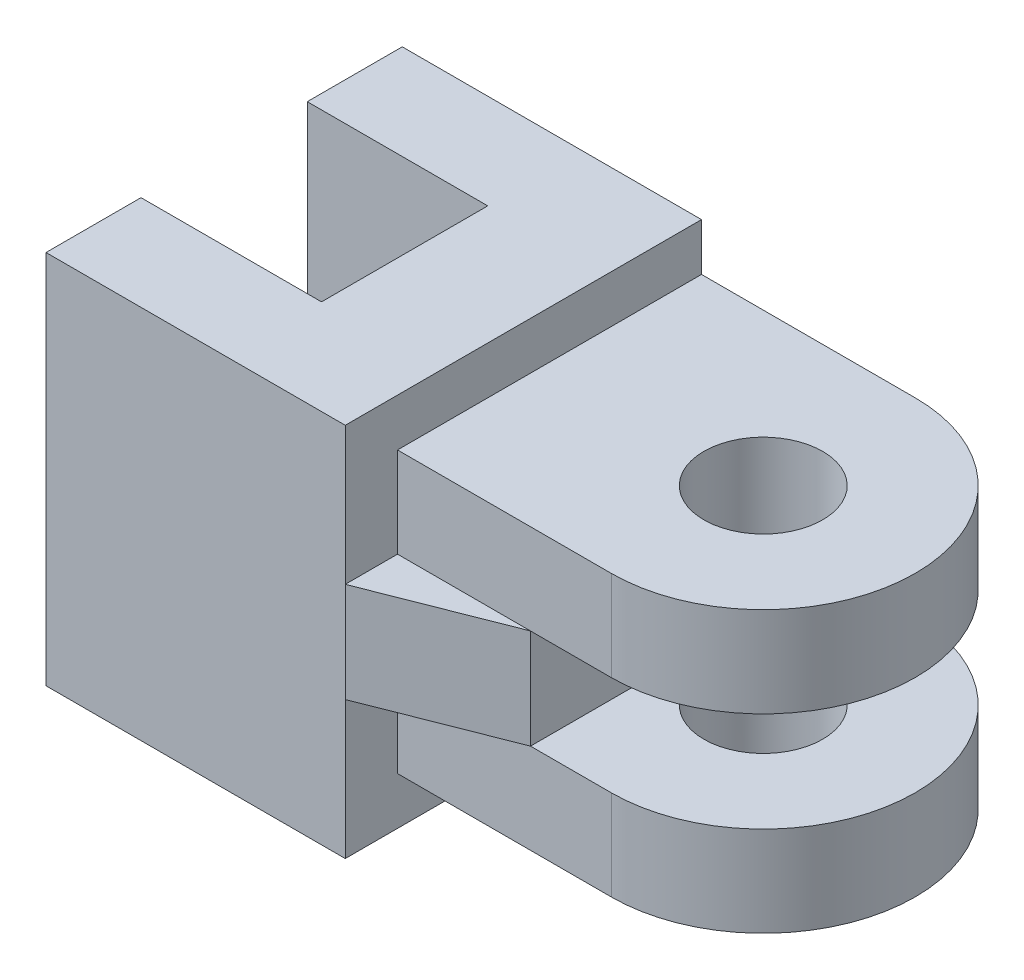
ISO-10303-21;
HEADER;
FILE_DESCRIPTION(('STEP AP214'),'2;1');
FILE_NAME('part.step','',(''),(''),'','','');
FILE_SCHEMA(('AUTOMOTIVE_DESIGN { 1 0 10303 214 1 1 1 1 }'));
ENDSEC;
DATA;
#1=APPLICATION_CONTEXT('core data for automotive mechanical design processes');
#2=APPLICATION_PROTOCOL_DEFINITION('international standard','automotive_design',2000,#1);
#3=PRODUCT_CONTEXT('',#1,'mechanical');
#4=PRODUCT('Part','Part','',(#3));
#5=PRODUCT_RELATED_PRODUCT_CATEGORY('part','',(#4));
#6=PRODUCT_DEFINITION_FORMATION('','',#4);
#7=PRODUCT_DEFINITION_CONTEXT('part definition',#1,'design');
#8=PRODUCT_DEFINITION('design','',#6,#7);
#9=PRODUCT_DEFINITION_SHAPE('','',#8);
#10=(LENGTH_UNIT() NAMED_UNIT(*) SI_UNIT(.MILLI.,.METRE.));
#11=(NAMED_UNIT(*) PLANE_ANGLE_UNIT() SI_UNIT($,.RADIAN.));
#12=(NAMED_UNIT(*) SI_UNIT($,.STERADIAN.) SOLID_ANGLE_UNIT());
#13=UNCERTAINTY_MEASURE_WITH_UNIT(LENGTH_MEASURE(1.E-05),#10,'distance_accuracy_value','');
#14=(GEOMETRIC_REPRESENTATION_CONTEXT(3) GLOBAL_UNCERTAINTY_ASSIGNED_CONTEXT((#13)) GLOBAL_UNIT_ASSIGNED_CONTEXT((#10,
#11,#12)) REPRESENTATION_CONTEXT('',''));
#15=CARTESIAN_POINT('',(0.,0.,0.));
#16=DIRECTION('',(0.,0.,1.));
#17=DIRECTION('',(1.,0.,0.));
#18=AXIS2_PLACEMENT_3D('',#15,#16,#17);
#19=CARTESIAN_POINT('',(31.5,39.5,37.5));
#20=DIRECTION('',(0.,1.,0.));
#21=DIRECTION('',(1.,0.,0.));
#22=AXIS2_PLACEMENT_3D('',#19,#20,#21);
#23=PLANE('',#22);
#24=DIRECTION('',(-1.,0.,0.));
#25=VECTOR('',#24,1.);
#26=CARTESIAN_POINT('',(15.75,39.5,55.));
#27=LINE('',#26,#25);
#28=CARTESIAN_POINT('',(38.,39.5,55.));
#29=VERTEX_POINT('',#28);
#30=CARTESIAN_POINT('',(0.,39.5,55.));
#31=VERTEX_POINT('',#30);
#32=EDGE_CURVE('E244',#29,#31,#27,.T.);
#33=ORIENTED_EDGE('',*,*,#32,.T.);
#34=DIRECTION('',(0.,0.,1.));
#35=VECTOR('',#34,1.);
#36=CARTESIAN_POINT('',(0.,39.5,0.));
#37=LINE('',#36,#35);
#38=CARTESIAN_POINT('',(0.,39.5,75.));
#39=VERTEX_POINT('',#38);
#40=EDGE_CURVE('E342',#31,#39,#37,.T.);
#41=ORIENTED_EDGE('',*,*,#40,.T.);
#42=DIRECTION('',(1.,0.,0.));
#43=VECTOR('',#42,1.);
#44=CARTESIAN_POINT('',(0.,39.5,75.));
#45=LINE('',#44,#43);
#46=CARTESIAN_POINT('',(63.,39.5,75.));
#47=VERTEX_POINT('',#46);
#48=EDGE_CURVE('E9',#39,#47,#45,.T.);
#49=ORIENTED_EDGE('',*,*,#48,.T.);
#50=DIRECTION('',(0.,0.,-1.));
#51=VECTOR('',#50,1.);
#52=CARTESIAN_POINT('',(63.,39.5,75.));
#53=LINE('',#52,#51);
#54=CARTESIAN_POINT('',(63.,39.5,0.));
#55=VERTEX_POINT('',#54);
#56=EDGE_CURVE('E278',#47,#55,#53,.T.);
#57=ORIENTED_EDGE('',*,*,#56,.T.);
#58=DIRECTION('',(-1.,0.,0.));
#59=VECTOR('',#58,1.);
#60=CARTESIAN_POINT('',(63.,39.5,0.));
#61=LINE('',#60,#59);
#62=CARTESIAN_POINT('',(0.,39.5,0.));
#63=VERTEX_POINT('',#62);
#64=EDGE_CURVE('E232',#55,#63,#61,.T.);
#65=ORIENTED_EDGE('',*,*,#64,.T.);
#66=DIRECTION('',(0.,0.,1.));
#67=VECTOR('',#66,1.);
#68=CARTESIAN_POINT('',(0.,39.5,0.));
#69=LINE('',#68,#67);
#70=CARTESIAN_POINT('',(0.,39.5,20.));
#71=VERTEX_POINT('',#70);
#72=EDGE_CURVE('E19',#63,#71,#69,.T.);
#73=ORIENTED_EDGE('',*,*,#72,.T.);
#74=DIRECTION('',(1.,0.,0.));
#75=VECTOR('',#74,1.);
#76=CARTESIAN_POINT('',(34.75,39.5,20.));
#77=LINE('',#76,#75);
#78=CARTESIAN_POINT('',(38.,39.5,20.));
#79=VERTEX_POINT('',#78);
#80=EDGE_CURVE('E269',#71,#79,#77,.T.);
#81=ORIENTED_EDGE('',*,*,#80,.T.);
#82=DIRECTION('',(0.,0.,1.));
#83=VECTOR('',#82,1.);
#84=CARTESIAN_POINT('',(38.,39.5,46.25));
#85=LINE('',#84,#83);
#86=EDGE_CURVE('E308',#79,#29,#85,.T.);
#87=ORIENTED_EDGE('',*,*,#86,.T.);
#88=EDGE_LOOP('',(#33,#41,#49,#57,#65,#73,#81,#87));
#89=FACE_BOUND('',#88,.T.);
#90=ADVANCED_FACE('F15',(#89),#23,.T.);
#91=CARTESIAN_POINT('',(0.,0.,75.));
#92=DIRECTION('',(0.,0.,1.));
#93=DIRECTION('',(1.,0.,0.));
#94=AXIS2_PLACEMENT_3D('',#91,#92,#93);
#95=PLANE('',#94);
#96=DIRECTION('',(0.,1.,0.));
#97=VECTOR('',#96,1.);
#98=CARTESIAN_POINT('',(63.,0.,75.));
#99=LINE('',#98,#97);
#100=CARTESIAN_POINT('',(63.,-39.5,75.));
#101=VERTEX_POINT('',#100);
#102=CARTESIAN_POINT('',(63.,-10.5,75.));
#103=VERTEX_POINT('',#102);
#104=EDGE_CURVE('E321',#101,#103,#99,.T.);
#105=ORIENTED_EDGE('',*,*,#104,.T.);
#106=DIRECTION('',(0.,1.,0.));
#107=VECTOR('',#106,1.);
#108=CARTESIAN_POINT('',(63.,0.,75.));
#109=LINE('',#108,#107);
#110=CARTESIAN_POINT('',(63.,10.5,75.));
#111=VERTEX_POINT('',#110);
#112=EDGE_CURVE('E233',#103,#111,#109,.T.);
#113=ORIENTED_EDGE('',*,*,#112,.T.);
#114=DIRECTION('',(0.,1.,0.));
#115=VECTOR('',#114,1.);
#116=CARTESIAN_POINT('',(63.,0.,75.));
#117=LINE('',#116,#115);
#118=EDGE_CURVE('E275',#111,#47,#117,.T.);
#119=ORIENTED_EDGE('',*,*,#118,.T.);
#120=ORIENTED_EDGE('',*,*,#48,.F.);
#121=DIRECTION('',(0.,1.,0.));
#122=VECTOR('',#121,1.);
#123=CARTESIAN_POINT('',(0.,0.,75.));
#124=LINE('',#123,#122);
#125=CARTESIAN_POINT('',(0.,-39.5,75.));
#126=VERTEX_POINT('',#125);
#127=EDGE_CURVE('E345',#126,#39,#124,.T.);
#128=ORIENTED_EDGE('',*,*,#127,.F.);
#129=DIRECTION('',(-1.,0.,0.));
#130=VECTOR('',#129,1.);
#131=CARTESIAN_POINT('',(0.,-39.5,75.));
#132=LINE('',#131,#130);
#133=EDGE_CURVE('E26',#101,#126,#132,.T.);
#134=ORIENTED_EDGE('',*,*,#133,.F.);
#135=EDGE_LOOP('',(#105,#113,#119,#120,#128,#134));
#136=FACE_BOUND('',#135,.T.);
#137=ADVANCED_FACE('F416',(#136),#95,.T.);
#138=CARTESIAN_POINT('',(31.5,-39.5,37.5));
#139=DIRECTION('',(0.,-1.,0.));
#140=DIRECTION('',(0.,0.,-1.));
#141=AXIS2_PLACEMENT_3D('',#138,#139,#140);
#142=PLANE('',#141);
#143=DIRECTION('',(1.,0.,0.));
#144=VECTOR('',#143,1.);
#145=CARTESIAN_POINT('',(15.75,-39.5,55.));
#146=LINE('',#145,#144);
#147=CARTESIAN_POINT('',(0.,-39.5,55.));
#148=VERTEX_POINT('',#147);
#149=CARTESIAN_POINT('',(38.,-39.5,55.));
#150=VERTEX_POINT('',#149);
#151=EDGE_CURVE('E243',#148,#150,#146,.T.);
#152=ORIENTED_EDGE('',*,*,#151,.T.);
#153=DIRECTION('',(0.,0.,-1.));
#154=VECTOR('',#153,1.);
#155=CARTESIAN_POINT('',(38.,-39.5,46.25));
#156=LINE('',#155,#154);
#157=CARTESIAN_POINT('',(38.,-39.5,20.));
#158=VERTEX_POINT('',#157);
#159=EDGE_CURVE('E93',#150,#158,#156,.T.);
#160=ORIENTED_EDGE('',*,*,#159,.T.);
#161=DIRECTION('',(-1.,0.,0.));
#162=VECTOR('',#161,1.);
#163=CARTESIAN_POINT('',(34.75,-39.5,20.));
#164=LINE('',#163,#162);
#165=CARTESIAN_POINT('',(0.,-39.5,20.));
#166=VERTEX_POINT('',#165);
#167=EDGE_CURVE('E268',#158,#166,#164,.T.);
#168=ORIENTED_EDGE('',*,*,#167,.T.);
#169=DIRECTION('',(0.,0.,-1.));
#170=VECTOR('',#169,1.);
#171=CARTESIAN_POINT('',(0.,-39.5,0.));
#172=LINE('',#171,#170);
#173=CARTESIAN_POINT('',(0.,-39.5,0.));
#174=VERTEX_POINT('',#173);
#175=EDGE_CURVE('E106',#166,#174,#172,.T.);
#176=ORIENTED_EDGE('',*,*,#175,.T.);
#177=DIRECTION('',(1.,0.,0.));
#178=VECTOR('',#177,1.);
#179=CARTESIAN_POINT('',(63.,-39.5,0.));
#180=LINE('',#179,#178);
#181=CARTESIAN_POINT('',(63.,-39.5,0.));
#182=VERTEX_POINT('',#181);
#183=EDGE_CURVE('E316',#174,#182,#180,.T.);
#184=ORIENTED_EDGE('',*,*,#183,.T.);
#185=DIRECTION('',(0.,0.,1.));
#186=VECTOR('',#185,1.);
#187=CARTESIAN_POINT('',(63.,-39.5,64.));
#188=LINE('',#187,#186);
#189=EDGE_CURVE('E325',#182,#101,#188,.T.);
#190=ORIENTED_EDGE('',*,*,#189,.T.);
#191=ORIENTED_EDGE('',*,*,#133,.T.);
#192=DIRECTION('',(0.,0.,-1.));
#193=VECTOR('',#192,1.);
#194=CARTESIAN_POINT('',(0.,-39.5,0.));
#195=LINE('',#194,#193);
#196=EDGE_CURVE('E354',#126,#148,#195,.T.);
#197=ORIENTED_EDGE('',*,*,#196,.T.);
#198=EDGE_LOOP('',(#152,#160,#168,#176,#184,#190,#191,#197));
#199=FACE_BOUND('',#198,.T.);
#200=ADVANCED_FACE('F420',(#199),#142,.T.);
#201=CARTESIAN_POINT('',(0.,0.,0.));
#202=DIRECTION('',(-1.,0.,0.));
#203=DIRECTION('',(0.,1.,0.));
#204=AXIS2_PLACEMENT_3D('',#201,#202,#203);
#205=PLANE('',#204);
#206=DIRECTION('',(0.,-1.,0.));
#207=VECTOR('',#206,1.);
#208=CARTESIAN_POINT('',(0.,0.,55.));
#209=LINE('',#208,#207);
#210=EDGE_CURVE('E304',#31,#148,#209,.T.);
#211=ORIENTED_EDGE('',*,*,#210,.T.);
#212=ORIENTED_EDGE('',*,*,#196,.F.);
#213=ORIENTED_EDGE('',*,*,#127,.T.);
#214=ORIENTED_EDGE('',*,*,#40,.F.);
#215=EDGE_LOOP('',(#211,#212,#213,#214));
#216=FACE_BOUND('',#215,.T.);
#217=ADVANCED_FACE('F414',(#216),#205,.T.);
#218=CARTESIAN_POINT('',(0.,0.,0.));
#219=DIRECTION('',(-1.,0.,0.));
#220=DIRECTION('',(0.,1.,0.));
#221=AXIS2_PLACEMENT_3D('',#218,#219,#220);
#222=PLANE('',#221);
#223=DIRECTION('',(0.,1.,0.));
#224=VECTOR('',#223,1.);
#225=CARTESIAN_POINT('',(0.,0.,20.));
#226=LINE('',#225,#224);
#227=EDGE_CURVE('E265',#166,#71,#226,.T.);
#228=ORIENTED_EDGE('',*,*,#227,.T.);
#229=ORIENTED_EDGE('',*,*,#72,.F.);
#230=DIRECTION('',(0.,-1.,0.));
#231=VECTOR('',#230,1.);
#232=CARTESIAN_POINT('',(0.,0.,0.));
#233=LINE('',#232,#231);
#234=EDGE_CURVE('E300',#63,#174,#233,.T.);
#235=ORIENTED_EDGE('',*,*,#234,.T.);
#236=ORIENTED_EDGE('',*,*,#175,.F.);
#237=EDGE_LOOP('',(#228,#229,#235,#236));
#238=FACE_BOUND('',#237,.T.);
#239=ADVANCED_FACE('F470',(#238),#222,.T.);
#240=CARTESIAN_POINT('',(38.,0.,55.));
#241=DIRECTION('',(1.,0.,0.));
#242=DIRECTION('',(0.,0.,-1.));
#243=AXIS2_PLACEMENT_3D('',#240,#241,#242);
#244=PLANE('',#243);
#245=ORIENTED_EDGE('',*,*,#86,.F.);
#246=DIRECTION('',(0.,1.,0.));
#247=VECTOR('',#246,1.);
#248=CARTESIAN_POINT('',(38.,0.,20.));
#249=LINE('',#248,#247);
#250=EDGE_CURVE('E293',#158,#79,#249,.T.);
#251=ORIENTED_EDGE('',*,*,#250,.F.);
#252=ORIENTED_EDGE('',*,*,#159,.F.);
#253=DIRECTION('',(0.,1.,0.));
#254=VECTOR('',#253,1.);
#255=CARTESIAN_POINT('',(38.,0.,55.));
#256=LINE('',#255,#254);
#257=EDGE_CURVE('E239',#150,#29,#256,.T.);
#258=ORIENTED_EDGE('',*,*,#257,.T.);
#259=EDGE_LOOP('',(#245,#251,#252,#258));
#260=FACE_BOUND('',#259,.T.);
#261=ADVANCED_FACE('F464',(#260),#244,.F.);
#262=CARTESIAN_POINT('',(38.,0.,20.));
#263=DIRECTION('',(0.,0.,-1.));
#264=DIRECTION('',(-1.,0.,0.));
#265=AXIS2_PLACEMENT_3D('',#262,#263,#264);
#266=PLANE('',#265);
#267=ORIENTED_EDGE('',*,*,#80,.F.);
#268=ORIENTED_EDGE('',*,*,#227,.F.);
#269=ORIENTED_EDGE('',*,*,#167,.F.);
#270=ORIENTED_EDGE('',*,*,#250,.T.);
#271=EDGE_LOOP('',(#267,#268,#269,#270));
#272=FACE_BOUND('',#271,.T.);
#273=ADVANCED_FACE('F469',(#272),#266,.F.);
#274=CARTESIAN_POINT('',(0.,0.,55.));
#275=DIRECTION('',(0.,0.,1.));
#276=DIRECTION('',(1.,0.,0.));
#277=AXIS2_PLACEMENT_3D('',#274,#275,#276);
#278=PLANE('',#277);
#279=ORIENTED_EDGE('',*,*,#32,.F.);
#280=ORIENTED_EDGE('',*,*,#257,.F.);
#281=ORIENTED_EDGE('',*,*,#151,.F.);
#282=ORIENTED_EDGE('',*,*,#210,.F.);
#283=EDGE_LOOP('',(#279,#280,#281,#282));
#284=FACE_BOUND('',#283,.T.);
#285=ADVANCED_FACE('F532',(#284),#278,.F.);
#286=CARTESIAN_POINT('',(77.,-29.5,32.));
#287=DIRECTION('',(0.,-1.,0.));
#288=DIRECTION('',(0.,0.,-1.));
#289=AXIS2_PLACEMENT_3D('',#286,#287,#288);
#290=PLANE('',#289);
#291=CARTESIAN_POINT('',(108.,-29.5,32.));
#292=DIRECTION('',(0.,1.,0.));
#293=DIRECTION('',(1.,0.,0.));
#294=AXIS2_PLACEMENT_3D('',#291,#292,#293);
#295=CIRCLE('',#294,12.5);
#296=CARTESIAN_POINT('',(120.5,-29.5,32.));
#297=VERTEX_POINT('',#296);
#298=EDGE_CURVE('E311',#297,#297,#295,.T.);
#299=ORIENTED_EDGE('',*,*,#298,.T.);
#300=EDGE_LOOP('',(#299));
#301=FACE_BOUND('',#300,.T.);
#302=CARTESIAN_POINT('',(108.,-29.5,32.));
#303=DIRECTION('',(0.,1.,0.));
#304=DIRECTION('',(0.,0.,1.));
#305=AXIS2_PLACEMENT_3D('',#302,#303,#304);
#306=CIRCLE('',#305,32.);
#307=CARTESIAN_POINT('',(108.,-29.5,64.));
#308=VERTEX_POINT('',#307);
#309=CARTESIAN_POINT('',(108.,-29.5,0.));
#310=VERTEX_POINT('',#309);
#311=EDGE_CURVE('E290',#308,#310,#306,.T.);
#312=ORIENTED_EDGE('',*,*,#311,.F.);
#313=DIRECTION('',(-1.,0.,0.));
#314=VECTOR('',#313,1.);
#315=CARTESIAN_POINT('',(63.,-29.5,64.));
#316=LINE('',#315,#314);
#317=CARTESIAN_POINT('',(63.,-29.5,64.));
#318=VERTEX_POINT('',#317);
#319=EDGE_CURVE('E273',#308,#318,#316,.T.);
#320=ORIENTED_EDGE('',*,*,#319,.T.);
#321=DIRECTION('',(0.,0.,1.));
#322=VECTOR('',#321,1.);
#323=CARTESIAN_POINT('',(63.,-29.5,53.5));
#324=LINE('',#323,#322);
#325=CARTESIAN_POINT('',(63.,-29.5,0.));
#326=VERTEX_POINT('',#325);
#327=EDGE_CURVE('E226',#326,#318,#324,.T.);
#328=ORIENTED_EDGE('',*,*,#327,.F.);
#329=DIRECTION('',(1.,0.,0.));
#330=VECTOR('',#329,1.);
#331=CARTESIAN_POINT('',(140.,-29.5,0.));
#332=LINE('',#331,#330);
#333=EDGE_CURVE('E259',#326,#310,#332,.T.);
#334=ORIENTED_EDGE('',*,*,#333,.T.);
#335=EDGE_LOOP('',(#312,#320,#328,#334));
#336=FACE_BOUND('',#335,.T.);
#337=ADVANCED_FACE('F537',(#301,#336),#290,.T.);
#338=CARTESIAN_POINT('',(77.,29.5,32.));
#339=DIRECTION('',(0.,1.,0.));
#340=DIRECTION('',(1.,0.,0.));
#341=AXIS2_PLACEMENT_3D('',#338,#339,#340);
#342=PLANE('',#341);
#343=CARTESIAN_POINT('',(108.,29.5,32.));
#344=DIRECTION('',(0.,-1.,0.));
#345=DIRECTION('',(1.,0.,0.));
#346=AXIS2_PLACEMENT_3D('',#343,#344,#345);
#347=CIRCLE('',#346,12.5);
#348=CARTESIAN_POINT('',(95.5,29.5,32.));
#349=VERTEX_POINT('',#348);
#350=EDGE_CURVE('E254',#349,#349,#347,.T.);
#351=ORIENTED_EDGE('',*,*,#350,.T.);
#352=EDGE_LOOP('',(#351));
#353=FACE_BOUND('',#352,.T.);
#354=CARTESIAN_POINT('',(108.,29.5,32.));
#355=DIRECTION('',(0.,-1.,0.));
#356=DIRECTION('',(0.,0.,1.));
#357=AXIS2_PLACEMENT_3D('',#354,#355,#356);
#358=CIRCLE('',#357,32.);
#359=CARTESIAN_POINT('',(108.,29.5,0.));
#360=VERTEX_POINT('',#359);
#361=CARTESIAN_POINT('',(108.,29.5,64.));
#362=VERTEX_POINT('',#361);
#363=EDGE_CURVE('E285',#360,#362,#358,.T.);
#364=ORIENTED_EDGE('',*,*,#363,.F.);
#365=DIRECTION('',(-1.,0.,0.));
#366=VECTOR('',#365,1.);
#367=CARTESIAN_POINT('',(140.,29.5,0.));
#368=LINE('',#367,#366);
#369=CARTESIAN_POINT('',(63.,29.5,0.));
#370=VERTEX_POINT('',#369);
#371=EDGE_CURVE('E208',#360,#370,#368,.T.);
#372=ORIENTED_EDGE('',*,*,#371,.T.);
#373=DIRECTION('',(0.,0.,-1.));
#374=VECTOR('',#373,1.);
#375=CARTESIAN_POINT('',(63.,29.5,53.5));
#376=LINE('',#375,#374);
#377=CARTESIAN_POINT('',(63.,29.5,64.));
#378=VERTEX_POINT('',#377);
#379=EDGE_CURVE('E205',#378,#370,#376,.T.);
#380=ORIENTED_EDGE('',*,*,#379,.F.);
#381=DIRECTION('',(1.,0.,0.));
#382=VECTOR('',#381,1.);
#383=CARTESIAN_POINT('',(63.,29.5,64.));
#384=LINE('',#383,#382);
#385=EDGE_CURVE('E189',#378,#362,#384,.T.);
#386=ORIENTED_EDGE('',*,*,#385,.T.);
#387=EDGE_LOOP('',(#364,#372,#380,#386));
#388=FACE_BOUND('',#387,.T.);
#389=ADVANCED_FACE('F206',(#353,#388),#342,.T.);
#390=CARTESIAN_POINT('',(108.,0.,32.));
#391=DIRECTION('',(0.,1.,0.));
#392=DIRECTION('',(0.,0.,1.));
#393=AXIS2_PLACEMENT_3D('',#390,#391,#392);
#394=CYLINDRICAL_SURFACE('',#393,32.);
#395=CARTESIAN_POINT('',(108.,10.5,32.));
#396=DIRECTION('',(0.,1.,0.));
#397=DIRECTION('',(0.,0.,1.));
#398=AXIS2_PLACEMENT_3D('',#395,#396,#397);
#399=CIRCLE('',#398,32.);
#400=CARTESIAN_POINT('',(108.,10.5,64.));
#401=VERTEX_POINT('',#400);
#402=CARTESIAN_POINT('',(108.,10.5,0.));
#403=VERTEX_POINT('',#402);
#404=EDGE_CURVE('E202',#401,#403,#399,.T.);
#405=ORIENTED_EDGE('',*,*,#404,.T.);
#406=DIRECTION('',(0.,1.,0.));
#407=VECTOR('',#406,1.);
#408=CARTESIAN_POINT('',(108.,0.,0.));
#409=LINE('',#408,#407);
#410=EDGE_CURVE('E231',#403,#360,#409,.T.);
#411=ORIENTED_EDGE('',*,*,#410,.T.);
#412=ORIENTED_EDGE('',*,*,#363,.T.);
#413=DIRECTION('',(0.,-1.,0.));
#414=VECTOR('',#413,1.);
#415=CARTESIAN_POINT('',(108.,0.,64.));
#416=LINE('',#415,#414);
#417=EDGE_CURVE('E198',#362,#401,#416,.T.);
#418=ORIENTED_EDGE('',*,*,#417,.T.);
#419=EDGE_LOOP('',(#405,#411,#412,#418));
#420=FACE_BOUND('',#419,.T.);
#421=ADVANCED_FACE('F525',(#420),#394,.T.);
#422=CARTESIAN_POINT('',(108.,0.,32.));
#423=DIRECTION('',(0.,1.,0.));
#424=DIRECTION('',(0.,0.,1.));
#425=AXIS2_PLACEMENT_3D('',#422,#423,#424);
#426=CYLINDRICAL_SURFACE('',#425,32.);
#427=CARTESIAN_POINT('',(108.,-10.5,32.));
#428=DIRECTION('',(0.,-1.,0.));
#429=DIRECTION('',(0.,0.,1.));
#430=AXIS2_PLACEMENT_3D('',#427,#428,#429);
#431=CIRCLE('',#430,32.);
#432=CARTESIAN_POINT('',(108.,-10.5,0.));
#433=VERTEX_POINT('',#432);
#434=CARTESIAN_POINT('',(108.,-10.5,64.));
#435=VERTEX_POINT('',#434);
#436=EDGE_CURVE('E249',#433,#435,#431,.T.);
#437=ORIENTED_EDGE('',*,*,#436,.T.);
#438=DIRECTION('',(0.,-1.,0.));
#439=VECTOR('',#438,1.);
#440=CARTESIAN_POINT('',(108.,0.,64.));
#441=LINE('',#440,#439);
#442=EDGE_CURVE('E270',#435,#308,#441,.T.);
#443=ORIENTED_EDGE('',*,*,#442,.T.);
#444=ORIENTED_EDGE('',*,*,#311,.T.);
#445=DIRECTION('',(0.,1.,0.));
#446=VECTOR('',#445,1.);
#447=CARTESIAN_POINT('',(108.,0.,0.));
#448=LINE('',#447,#446);
#449=EDGE_CURVE('E256',#310,#433,#448,.T.);
#450=ORIENTED_EDGE('',*,*,#449,.T.);
#451=EDGE_LOOP('',(#437,#443,#444,#450));
#452=FACE_BOUND('',#451,.T.);
#453=ADVANCED_FACE('F520',(#452),#426,.T.);
#454=CARTESIAN_POINT('',(63.,0.,0.));
#455=DIRECTION('',(0.,0.,-1.));
#456=DIRECTION('',(0.,-1.,0.));
#457=AXIS2_PLACEMENT_3D('',#454,#455,#456);
#458=PLANE('',#457);
#459=DIRECTION('',(-1.,0.,0.));
#460=VECTOR('',#459,1.);
#461=CARTESIAN_POINT('',(89.25,10.5,0.));
#462=LINE('',#461,#460);
#463=CARTESIAN_POINT('',(91.,10.5,0.));
#464=VERTEX_POINT('',#463);
#465=EDGE_CURVE('E245',#403,#464,#462,.T.);
#466=ORIENTED_EDGE('',*,*,#465,.T.);
#467=DIRECTION('',(0.,-1.,0.));
#468=VECTOR('',#467,1.);
#469=CARTESIAN_POINT('',(91.,0.,0.));
#470=LINE('',#469,#468);
#471=CARTESIAN_POINT('',(91.,-10.5,0.));
#472=VERTEX_POINT('',#471);
#473=EDGE_CURVE('E260',#464,#472,#470,.T.);
#474=ORIENTED_EDGE('',*,*,#473,.T.);
#475=DIRECTION('',(1.,0.,0.));
#476=VECTOR('',#475,1.);
#477=CARTESIAN_POINT('',(89.25,-10.5,0.));
#478=LINE('',#477,#476);
#479=EDGE_CURVE('E315',#472,#433,#478,.T.);
#480=ORIENTED_EDGE('',*,*,#479,.T.);
#481=ORIENTED_EDGE('',*,*,#449,.F.);
#482=ORIENTED_EDGE('',*,*,#333,.F.);
#483=DIRECTION('',(0.,1.,0.));
#484=VECTOR('',#483,1.);
#485=CARTESIAN_POINT('',(63.,0.,0.));
#486=LINE('',#485,#484);
#487=EDGE_CURVE('E365',#182,#326,#486,.T.);
#488=ORIENTED_EDGE('',*,*,#487,.F.);
#489=ORIENTED_EDGE('',*,*,#183,.F.);
#490=ORIENTED_EDGE('',*,*,#234,.F.);
#491=ORIENTED_EDGE('',*,*,#64,.F.);
#492=DIRECTION('',(0.,1.,0.));
#493=VECTOR('',#492,1.);
#494=CARTESIAN_POINT('',(63.,0.,0.));
#495=LINE('',#494,#493);
#496=EDGE_CURVE('E213',#370,#55,#495,.T.);
#497=ORIENTED_EDGE('',*,*,#496,.F.);
#498=ORIENTED_EDGE('',*,*,#371,.F.);
#499=ORIENTED_EDGE('',*,*,#410,.F.);
#500=EDGE_LOOP('',(#466,#474,#480,#481,#482,#488,#489,#490,#491,#497,#498,#499));
#501=FACE_BOUND('',#500,.T.);
#502=ADVANCED_FACE('F513',(#501),#458,.T.);
#503=CARTESIAN_POINT('',(91.,0.,0.));
#504=DIRECTION('',(-1.,0.,0.));
#505=DIRECTION('',(0.,0.,1.));
#506=AXIS2_PLACEMENT_3D('',#503,#504,#505);
#507=PLANE('',#506);
#508=DIRECTION('',(0.,1.,0.));
#509=VECTOR('',#508,1.);
#510=CARTESIAN_POINT('',(91.,0.,64.));
#511=LINE('',#510,#509);
#512=CARTESIAN_POINT('',(91.,-10.5,64.));
#513=VERTEX_POINT('',#512);
#514=CARTESIAN_POINT('',(91.,10.5,64.));
#515=VERTEX_POINT('',#514);
#516=EDGE_CURVE('E341',#513,#515,#511,.T.);
#517=ORIENTED_EDGE('',*,*,#516,.F.);
#518=DIRECTION('',(0.,0.,-1.));
#519=VECTOR('',#518,1.);
#520=CARTESIAN_POINT('',(91.,-10.5,0.));
#521=LINE('',#520,#519);
#522=EDGE_CURVE('E281',#513,#472,#521,.T.);
#523=ORIENTED_EDGE('',*,*,#522,.T.);
#524=ORIENTED_EDGE('',*,*,#473,.F.);
#525=DIRECTION('',(0.,0.,1.));
#526=VECTOR('',#525,1.);
#527=CARTESIAN_POINT('',(91.,10.5,0.));
#528=LINE('',#527,#526);
#529=EDGE_CURVE('E250',#464,#515,#528,.T.);
#530=ORIENTED_EDGE('',*,*,#529,.T.);
#531=EDGE_LOOP('',(#517,#523,#524,#530));
#532=FACE_BOUND('',#531,.T.);
#533=ADVANCED_FACE('F483',(#532),#507,.F.);
#534=CARTESIAN_POINT('',(115.5,-10.5,32.));
#535=DIRECTION('',(0.,-1.,0.));
#536=DIRECTION('',(0.,0.,-1.));
#537=AXIS2_PLACEMENT_3D('',#534,#535,#536);
#538=PLANE('',#537);
#539=CARTESIAN_POINT('',(108.,-10.5,32.));
#540=DIRECTION('',(0.,-1.,0.));
#541=DIRECTION('',(1.,0.,0.));
#542=AXIS2_PLACEMENT_3D('',#539,#540,#541);
#543=CIRCLE('',#542,12.5);
#544=CARTESIAN_POINT('',(95.5,-10.5,32.));
#545=VERTEX_POINT('',#544);
#546=EDGE_CURVE('E255',#545,#545,#543,.T.);
#547=ORIENTED_EDGE('',*,*,#546,.T.);
#548=EDGE_LOOP('',(#547));
#549=FACE_BOUND('',#548,.T.);
#550=ORIENTED_EDGE('',*,*,#436,.F.);
#551=ORIENTED_EDGE('',*,*,#479,.F.);
#552=ORIENTED_EDGE('',*,*,#522,.F.);
#553=DIRECTION('',(-1.,0.,0.));
#554=VECTOR('',#553,1.);
#555=CARTESIAN_POINT('',(89.25,-10.5,64.));
#556=LINE('',#555,#554);
#557=EDGE_CURVE('E264',#435,#513,#556,.T.);
#558=ORIENTED_EDGE('',*,*,#557,.F.);
#559=EDGE_LOOP('',(#550,#551,#552,#558));
#560=FACE_BOUND('',#559,.T.);
#561=ADVANCED_FACE('F477',(#549,#560),#538,.F.);
#562=CARTESIAN_POINT('',(115.5,10.5,32.));
#563=DIRECTION('',(0.,1.,0.));
#564=DIRECTION('',(1.,0.,0.));
#565=AXIS2_PLACEMENT_3D('',#562,#563,#564);
#566=PLANE('',#565);
#567=CARTESIAN_POINT('',(108.,10.5,32.));
#568=DIRECTION('',(0.,1.,0.));
#569=DIRECTION('',(1.,0.,0.));
#570=AXIS2_PLACEMENT_3D('',#567,#568,#569);
#571=CIRCLE('',#570,12.5);
#572=CARTESIAN_POINT('',(95.5,10.5,32.));
#573=VERTEX_POINT('',#572);
#574=EDGE_CURVE('E251',#573,#573,#571,.T.);
#575=ORIENTED_EDGE('',*,*,#574,.T.);
#576=EDGE_LOOP('',(#575));
#577=FACE_BOUND('',#576,.T.);
#578=ORIENTED_EDGE('',*,*,#404,.F.);
#579=DIRECTION('',(1.,0.,0.));
#580=VECTOR('',#579,1.);
#581=CARTESIAN_POINT('',(89.25,10.5,64.));
#582=LINE('',#581,#580);
#583=EDGE_CURVE('E261',#515,#401,#582,.T.);
#584=ORIENTED_EDGE('',*,*,#583,.F.);
#585=ORIENTED_EDGE('',*,*,#529,.F.);
#586=ORIENTED_EDGE('',*,*,#465,.F.);
#587=EDGE_LOOP('',(#578,#584,#585,#586));
#588=FACE_BOUND('',#587,.T.);
#589=ADVANCED_FACE('F482',(#577,#588),#566,.F.);
#590=CARTESIAN_POINT('',(63.,0.,64.));
#591=DIRECTION('',(0.,0.,1.));
#592=DIRECTION('',(1.,0.,0.));
#593=AXIS2_PLACEMENT_3D('',#590,#591,#592);
#594=PLANE('',#593);
#595=DIRECTION('',(1.,0.,0.));
#596=VECTOR('',#595,1.);
#597=CARTESIAN_POINT('',(68.8854022391229,10.5,64.));
#598=LINE('',#597,#596);
#599=CARTESIAN_POINT('',(63.,10.5,64.));
#600=VERTEX_POINT('',#599);
#601=EDGE_CURVE('E237',#600,#515,#598,.T.);
#602=ORIENTED_EDGE('',*,*,#601,.T.);
#603=ORIENTED_EDGE('',*,*,#583,.T.);
#604=ORIENTED_EDGE('',*,*,#417,.F.);
#605=ORIENTED_EDGE('',*,*,#385,.F.);
#606=DIRECTION('',(0.,1.,0.));
#607=VECTOR('',#606,1.);
#608=CARTESIAN_POINT('',(63.,0.,64.));
#609=LINE('',#608,#607);
#610=EDGE_CURVE('E194',#600,#378,#609,.T.);
#611=ORIENTED_EDGE('',*,*,#610,.F.);
#612=EDGE_LOOP('',(#602,#603,#604,#605,#611));
#613=FACE_BOUND('',#612,.T.);
#614=ADVANCED_FACE('F192',(#613),#594,.T.);
#615=CARTESIAN_POINT('',(63.,0.,64.));
#616=DIRECTION('',(0.,0.,1.));
#617=DIRECTION('',(1.,0.,0.));
#618=AXIS2_PLACEMENT_3D('',#615,#616,#617);
#619=PLANE('',#618);
#620=DIRECTION('',(-1.,0.,0.));
#621=VECTOR('',#620,1.);
#622=CARTESIAN_POINT('',(68.8854022391229,-10.5,64.));
#623=LINE('',#622,#621);
#624=CARTESIAN_POINT('',(63.,-10.5,64.));
#625=VERTEX_POINT('',#624);
#626=EDGE_CURVE('E360',#513,#625,#623,.T.);
#627=ORIENTED_EDGE('',*,*,#626,.T.);
#628=DIRECTION('',(0.,1.,0.));
#629=VECTOR('',#628,1.);
#630=CARTESIAN_POINT('',(63.,0.,64.));
#631=LINE('',#630,#629);
#632=EDGE_CURVE('E221',#318,#625,#631,.T.);
#633=ORIENTED_EDGE('',*,*,#632,.F.);
#634=ORIENTED_EDGE('',*,*,#319,.F.);
#635=ORIENTED_EDGE('',*,*,#442,.F.);
#636=ORIENTED_EDGE('',*,*,#557,.T.);
#637=EDGE_LOOP('',(#627,#633,#634,#635,#636));
#638=FACE_BOUND('',#637,.T.);
#639=ADVANCED_FACE('F17',(#638),#619,.T.);
#640=CARTESIAN_POINT('',(63.,0.,75.));
#641=DIRECTION('',(1.,0.,0.));
#642=DIRECTION('',(0.,0.,-1.));
#643=AXIS2_PLACEMENT_3D('',#640,#641,#642);
#644=PLANE('',#643);
#645=DIRECTION('',(0.,0.,-1.));
#646=VECTOR('',#645,1.);
#647=CARTESIAN_POINT('',(63.,10.5,71.1354022391228));
#648=LINE('',#647,#646);
#649=EDGE_CURVE('E218',#111,#600,#648,.T.);
#650=ORIENTED_EDGE('',*,*,#649,.T.);
#651=ORIENTED_EDGE('',*,*,#610,.T.);
#652=ORIENTED_EDGE('',*,*,#379,.T.);
#653=ORIENTED_EDGE('',*,*,#496,.T.);
#654=ORIENTED_EDGE('',*,*,#56,.F.);
#655=ORIENTED_EDGE('',*,*,#118,.F.);
#656=EDGE_LOOP('',(#650,#651,#652,#653,#654,#655));
#657=FACE_BOUND('',#656,.T.);
#658=ADVANCED_FACE('F215',(#657),#644,.T.);
#659=CARTESIAN_POINT('',(63.,0.,75.));
#660=DIRECTION('',(1.,0.,0.));
#661=DIRECTION('',(0.,0.,-1.));
#662=AXIS2_PLACEMENT_3D('',#659,#660,#661);
#663=PLANE('',#662);
#664=DIRECTION('',(0.,0.,1.));
#665=VECTOR('',#664,1.);
#666=CARTESIAN_POINT('',(63.,-10.5,71.1354022391228));
#667=LINE('',#666,#665);
#668=EDGE_CURVE('E349',#625,#103,#667,.T.);
#669=ORIENTED_EDGE('',*,*,#668,.T.);
#670=ORIENTED_EDGE('',*,*,#104,.F.);
#671=ORIENTED_EDGE('',*,*,#189,.F.);
#672=ORIENTED_EDGE('',*,*,#487,.T.);
#673=ORIENTED_EDGE('',*,*,#327,.T.);
#674=ORIENTED_EDGE('',*,*,#632,.T.);
#675=EDGE_LOOP('',(#669,#670,#671,#672,#673,#674));
#676=FACE_BOUND('',#675,.T.);
#677=ADVANCED_FACE('F424',(#676),#663,.T.);
#678=CARTESIAN_POINT('',(74.7708044782457,10.5,67.2708044782456));
#679=DIRECTION('',(0.,1.,0.));
#680=DIRECTION('',(1.,0.,0.));
#681=AXIS2_PLACEMENT_3D('',#678,#679,#680);
#682=PLANE('',#681);
#683=DIRECTION('',(0.930751493440347,0.,-0.365652372422993));
#684=VECTOR('',#683,1.);
#685=CARTESIAN_POINT('',(63.,10.5,75.));
#686=LINE('',#685,#684);
#687=EDGE_CURVE('E238',#111,#515,#686,.T.);
#688=ORIENTED_EDGE('',*,*,#687,.T.);
#689=ORIENTED_EDGE('',*,*,#601,.F.);
#690=ORIENTED_EDGE('',*,*,#649,.F.);
#691=EDGE_LOOP('',(#688,#689,#690));
#692=FACE_BOUND('',#691,.T.);
#693=ADVANCED_FACE('F587',(#692),#682,.T.);
#694=CARTESIAN_POINT('',(63.,0.,75.));
#695=DIRECTION('',(0.365652372422993,0.,0.930751493440347));
#696=DIRECTION('',(0.,-1.,0.));
#697=AXIS2_PLACEMENT_3D('',#694,#695,#696);
#698=PLANE('',#697);
#699=ORIENTED_EDGE('',*,*,#516,.T.);
#700=ORIENTED_EDGE('',*,*,#687,.F.);
#701=ORIENTED_EDGE('',*,*,#112,.F.);
#702=DIRECTION('',(-0.930751493440347,0.,0.365652372422993));
#703=VECTOR('',#702,1.);
#704=CARTESIAN_POINT('',(63.,-10.5,75.));
#705=LINE('',#704,#703);
#706=EDGE_CURVE('E296',#513,#103,#705,.T.);
#707=ORIENTED_EDGE('',*,*,#706,.F.);
#708=EDGE_LOOP('',(#699,#700,#701,#707));
#709=FACE_BOUND('',#708,.T.);
#710=ADVANCED_FACE('F434',(#709),#698,.T.);
#711=CARTESIAN_POINT('',(74.7708044782457,-10.5,67.2708044782456));
#712=DIRECTION('',(0.,-1.,0.));
#713=DIRECTION('',(0.,0.,-1.));
#714=AXIS2_PLACEMENT_3D('',#711,#712,#713);
#715=PLANE('',#714);
#716=ORIENTED_EDGE('',*,*,#706,.T.);
#717=ORIENTED_EDGE('',*,*,#668,.F.);
#718=ORIENTED_EDGE('',*,*,#626,.F.);
#719=EDGE_LOOP('',(#716,#717,#718));
#720=FACE_BOUND('',#719,.T.);
#721=ADVANCED_FACE('F432',(#720),#715,.T.);
#722=CARTESIAN_POINT('',(108.,147.886583483645,32.));
#723=DIRECTION('',(0.,-1.,0.));
#724=DIRECTION('',(1.,0.,0.));
#725=AXIS2_PLACEMENT_3D('',#722,#723,#724);
#726=CYLINDRICAL_SURFACE('',#725,12.5);
#727=ORIENTED_EDGE('',*,*,#350,.F.);
#728=EDGE_LOOP('',(#727));
#729=FACE_BOUND('',#728,.T.);
#730=ORIENTED_EDGE('',*,*,#574,.F.);
#731=EDGE_LOOP('',(#730));
#732=FACE_BOUND('',#731,.T.);
#733=ADVANCED_FACE('F620',(#729,#732),#726,.F.);
#734=CARTESIAN_POINT('',(108.,147.886583483645,32.));
#735=DIRECTION('',(0.,-1.,0.));
#736=DIRECTION('',(1.,0.,0.));
#737=AXIS2_PLACEMENT_3D('',#734,#735,#736);
#738=CYLINDRICAL_SURFACE('',#737,12.5);
#739=ORIENTED_EDGE('',*,*,#546,.F.);
#740=EDGE_LOOP('',(#739));
#741=FACE_BOUND('',#740,.T.);
#742=ORIENTED_EDGE('',*,*,#298,.F.);
#743=EDGE_LOOP('',(#742));
#744=FACE_BOUND('',#743,.T.);
#745=ADVANCED_FACE('F642',(#741,#744),#738,.F.);
#746=CLOSED_SHELL('',(#90,#137,#200,#217,#239,#261,#273,#285,#337,#389,#421,#453,#502,#533,#561,
#589,#614,#639,#658,#677,#693,#710,#721,#733,#745));
#747=MANIFOLD_SOLID_BREP('B1',#746);
#748=ADVANCED_BREP_SHAPE_REPRESENTATION('',(#18,#747),#14);
#749=SHAPE_DEFINITION_REPRESENTATION(#9,#748);
ENDSEC;
END-ISO-10303-21;
